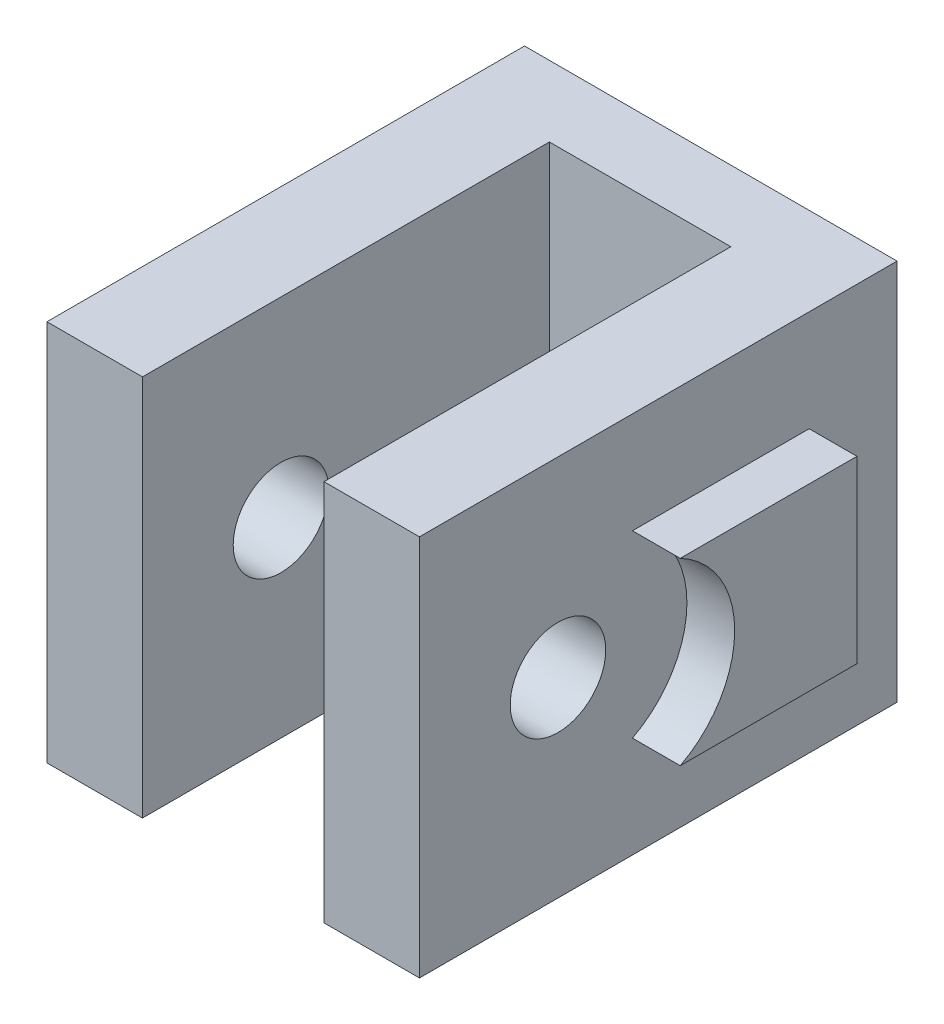
ISO-10303-21;
HEADER;
FILE_DESCRIPTION(('STEP AP214'),'2;1');
FILE_NAME('part.step','',(''),(''),'','','');
FILE_SCHEMA(('AUTOMOTIVE_DESIGN { 1 0 10303 214 1 1 1 1 }'));
ENDSEC;
DATA;
#1=APPLICATION_CONTEXT('core data for automotive mechanical design processes');
#2=APPLICATION_PROTOCOL_DEFINITION('international standard','automotive_design',2000,#1);
#3=PRODUCT_CONTEXT('',#1,'mechanical');
#4=PRODUCT('Part','Part','',(#3));
#5=PRODUCT_RELATED_PRODUCT_CATEGORY('part','',(#4));
#6=PRODUCT_DEFINITION_FORMATION('','',#4);
#7=PRODUCT_DEFINITION_CONTEXT('part definition',#1,'design');
#8=PRODUCT_DEFINITION('design','',#6,#7);
#9=PRODUCT_DEFINITION_SHAPE('','',#8);
#10=(LENGTH_UNIT() NAMED_UNIT(*) SI_UNIT(.MILLI.,.METRE.));
#11=(NAMED_UNIT(*) PLANE_ANGLE_UNIT() SI_UNIT($,.RADIAN.));
#12=(NAMED_UNIT(*) SI_UNIT($,.STERADIAN.) SOLID_ANGLE_UNIT());
#13=UNCERTAINTY_MEASURE_WITH_UNIT(LENGTH_MEASURE(1.E-05),#10,'distance_accuracy_value','');
#14=(GEOMETRIC_REPRESENTATION_CONTEXT(3) GLOBAL_UNCERTAINTY_ASSIGNED_CONTEXT((#13)) GLOBAL_UNIT_ASSIGNED_CONTEXT((#10,
#11,#12)) REPRESENTATION_CONTEXT('',''));
#15=CARTESIAN_POINT('',(0.,0.,0.));
#16=DIRECTION('',(0.,0.,1.));
#17=DIRECTION('',(1.,0.,0.));
#18=AXIS2_PLACEMENT_3D('',#15,#16,#17);
#19=CARTESIAN_POINT('',(0.,20.,0.));
#20=DIRECTION('',(1.,0.,0.));
#21=DIRECTION('',(0.,0.,-1.));
#22=AXIS2_PLACEMENT_3D('',#19,#20,#21);
#23=PLANE('',#22);
#24=DIRECTION('',(0.,0.,1.));
#25=VECTOR('',#24,1.);
#26=CARTESIAN_POINT('',(0.,0.,0.));
#27=LINE('',#26,#25);
#28=CARTESIAN_POINT('',(0.,0.,0.));
#29=VERTEX_POINT('',#28);
#30=CARTESIAN_POINT('',(0.,0.,25.));
#31=VERTEX_POINT('',#30);
#32=EDGE_CURVE('E258',#29,#31,#27,.T.);
#33=ORIENTED_EDGE('',*,*,#32,.T.);
#34=DIRECTION('',(0.,-1.,0.));
#35=VECTOR('',#34,1.);
#36=CARTESIAN_POINT('',(0.,20.,25.));
#37=LINE('',#36,#35);
#38=CARTESIAN_POINT('',(0.,20.,25.));
#39=VERTEX_POINT('',#38);
#40=EDGE_CURVE('E11',#39,#31,#37,.T.);
#41=ORIENTED_EDGE('',*,*,#40,.F.);
#42=DIRECTION('',(0.,0.,1.));
#43=VECTOR('',#42,1.);
#44=CARTESIAN_POINT('',(0.,20.,0.));
#45=LINE('',#44,#43);
#46=CARTESIAN_POINT('',(0.,20.,0.));
#47=VERTEX_POINT('',#46);
#48=EDGE_CURVE('E239',#47,#39,#45,.T.);
#49=ORIENTED_EDGE('',*,*,#48,.F.);
#50=DIRECTION('',(0.,-1.,0.));
#51=VECTOR('',#50,1.);
#52=CARTESIAN_POINT('',(0.,20.,0.));
#53=LINE('',#52,#51);
#54=EDGE_CURVE('E257',#47,#29,#53,.T.);
#55=ORIENTED_EDGE('',*,*,#54,.T.);
#56=EDGE_LOOP('',(#33,#41,#49,#55));
#57=FACE_BOUND('',#56,.T.);
#58=CARTESIAN_POINT('',(0.,10.,17.75));
#59=DIRECTION('',(1.,0.,0.));
#60=DIRECTION('',(0.,0.,-1.));
#61=AXIS2_PLACEMENT_3D('',#58,#59,#60);
#62=CIRCLE('',#61,2.5);
#63=CARTESIAN_POINT('',(0.,10.,15.25));
#64=VERTEX_POINT('',#63);
#65=EDGE_CURVE('E225',#64,#64,#62,.T.);
#66=ORIENTED_EDGE('',*,*,#65,.T.);
#67=EDGE_LOOP('',(#66));
#68=FACE_BOUND('',#67,.T.);
#69=CARTESIAN_POINT('',(0.,10.,16.2994897427832));
#70=DIRECTION('',(1.,0.,0.));
#71=DIRECTION('',(0.,0.,-1.));
#72=AXIS2_PLACEMENT_3D('',#69,#70,#71);
#73=CIRCLE('',#72,5.3);
#74=CARTESIAN_POINT('',(0.,5.3,13.85));
#75=VERTEX_POINT('',#74);
#76=CARTESIAN_POINT('',(0.,14.7,13.85));
#77=VERTEX_POINT('',#76);
#78=EDGE_CURVE('E186',#75,#77,#73,.T.);
#79=ORIENTED_EDGE('',*,*,#78,.F.);
#80=DIRECTION('',(0.,0.,-1.));
#81=VECTOR('',#80,1.);
#82=CARTESIAN_POINT('',(0.,5.3,13.85));
#83=LINE('',#82,#81);
#84=CARTESIAN_POINT('',(0.,5.3,4.60000000000001));
#85=VERTEX_POINT('',#84);
#86=EDGE_CURVE('E164',#75,#85,#83,.T.);
#87=ORIENTED_EDGE('',*,*,#86,.T.);
#88=DIRECTION('',(0.,-1.,0.));
#89=VECTOR('',#88,1.);
#90=CARTESIAN_POINT('',(0.,14.7,4.60000000000001));
#91=LINE('',#90,#89);
#92=CARTESIAN_POINT('',(0.,14.7,4.60000000000001));
#93=VERTEX_POINT('',#92);
#94=EDGE_CURVE('E58',#93,#85,#91,.T.);
#95=ORIENTED_EDGE('',*,*,#94,.F.);
#96=DIRECTION('',(0.,0.,-1.));
#97=VECTOR('',#96,1.);
#98=CARTESIAN_POINT('',(0.,14.7,13.85));
#99=LINE('',#98,#97);
#100=EDGE_CURVE('E177',#77,#93,#99,.T.);
#101=ORIENTED_EDGE('',*,*,#100,.F.);
#102=EDGE_LOOP('',(#79,#87,#95,#101));
#103=FACE_BOUND('',#102,.T.);
#104=ADVANCED_FACE('F43',(#57,#68,#103),#23,.F.);
#105=CARTESIAN_POINT('',(0.,20.,25.));
#106=DIRECTION('',(0.,0.,-1.));
#107=DIRECTION('',(-1.,0.,0.));
#108=AXIS2_PLACEMENT_3D('',#105,#106,#107);
#109=PLANE('',#108);
#110=DIRECTION('',(1.,0.,0.));
#111=VECTOR('',#110,1.);
#112=CARTESIAN_POINT('',(0.,0.,25.));
#113=LINE('',#112,#111);
#114=CARTESIAN_POINT('',(5.,0.,25.));
#115=VERTEX_POINT('',#114);
#116=EDGE_CURVE('E261',#31,#115,#113,.T.);
#117=ORIENTED_EDGE('',*,*,#116,.T.);
#118=DIRECTION('',(0.,-1.,0.));
#119=VECTOR('',#118,1.);
#120=CARTESIAN_POINT('',(5.,20.,25.));
#121=LINE('',#120,#119);
#122=CARTESIAN_POINT('',(5.,20.,25.));
#123=VERTEX_POINT('',#122);
#124=EDGE_CURVE('E51',#123,#115,#121,.T.);
#125=ORIENTED_EDGE('',*,*,#124,.F.);
#126=DIRECTION('',(1.,0.,0.));
#127=VECTOR('',#126,1.);
#128=CARTESIAN_POINT('',(0.,20.,25.));
#129=LINE('',#128,#127);
#130=EDGE_CURVE('E242',#39,#123,#129,.T.);
#131=ORIENTED_EDGE('',*,*,#130,.F.);
#132=ORIENTED_EDGE('',*,*,#40,.T.);
#133=EDGE_LOOP('',(#117,#125,#131,#132));
#134=FACE_BOUND('',#133,.T.);
#135=ADVANCED_FACE('F319',(#134),#109,.F.);
#136=CARTESIAN_POINT('',(5.,20.,25.));
#137=DIRECTION('',(-1.,0.,0.));
#138=DIRECTION('',(0.,0.,1.));
#139=AXIS2_PLACEMENT_3D('',#136,#137,#138);
#140=PLANE('',#139);
#141=CARTESIAN_POINT('',(5.,10.,17.75));
#142=DIRECTION('',(-1.,0.,0.));
#143=DIRECTION('',(0.,0.,1.));
#144=AXIS2_PLACEMENT_3D('',#141,#142,#143);
#145=CIRCLE('',#144,2.5);
#146=CARTESIAN_POINT('',(5.,10.,20.25));
#147=VERTEX_POINT('',#146);
#148=EDGE_CURVE('E233',#147,#147,#145,.T.);
#149=ORIENTED_EDGE('',*,*,#148,.T.);
#150=EDGE_LOOP('',(#149));
#151=FACE_BOUND('',#150,.T.);
#152=DIRECTION('',(0.,0.,-1.));
#153=VECTOR('',#152,1.);
#154=CARTESIAN_POINT('',(5.,0.,25.));
#155=LINE('',#154,#153);
#156=CARTESIAN_POINT('',(5.,0.,3.7));
#157=VERTEX_POINT('',#156);
#158=EDGE_CURVE('E263',#115,#157,#155,.T.);
#159=ORIENTED_EDGE('',*,*,#158,.T.);
#160=DIRECTION('',(0.,-1.,0.));
#161=VECTOR('',#160,1.);
#162=CARTESIAN_POINT('',(5.,20.,3.7));
#163=LINE('',#162,#161);
#164=CARTESIAN_POINT('',(5.,20.,3.7));
#165=VERTEX_POINT('',#164);
#166=EDGE_CURVE('E288',#165,#157,#163,.T.);
#167=ORIENTED_EDGE('',*,*,#166,.F.);
#168=DIRECTION('',(0.,0.,-1.));
#169=VECTOR('',#168,1.);
#170=CARTESIAN_POINT('',(5.,20.,25.));
#171=LINE('',#170,#169);
#172=EDGE_CURVE('E245',#123,#165,#171,.T.);
#173=ORIENTED_EDGE('',*,*,#172,.F.);
#174=ORIENTED_EDGE('',*,*,#124,.T.);
#175=EDGE_LOOP('',(#159,#167,#173,#174));
#176=FACE_BOUND('',#175,.T.);
#177=ADVANCED_FACE('F296',(#151,#176),#140,.F.);
#178=CARTESIAN_POINT('',(5.,20.,3.7));
#179=DIRECTION('',(0.,0.,-1.));
#180=DIRECTION('',(-1.,0.,0.));
#181=AXIS2_PLACEMENT_3D('',#178,#179,#180);
#182=PLANE('',#181);
#183=CARTESIAN_POINT('',(9.75,10.,3.7));
#184=DIRECTION('',(0.,0.,-1.));
#185=DIRECTION('',(-1.,0.,0.));
#186=AXIS2_PLACEMENT_3D('',#183,#184,#185);
#187=CIRCLE('',#186,2.1);
#188=CARTESIAN_POINT('',(7.65,10.,3.7));
#189=VERTEX_POINT('',#188);
#190=EDGE_CURVE('E46',#189,#189,#187,.T.);
#191=ORIENTED_EDGE('',*,*,#190,.T.);
#192=EDGE_LOOP('',(#191));
#193=FACE_BOUND('',#192,.T.);
#194=DIRECTION('',(1.,0.,0.));
#195=VECTOR('',#194,1.);
#196=CARTESIAN_POINT('',(5.,0.,3.7));
#197=LINE('',#196,#195);
#198=CARTESIAN_POINT('',(14.5,0.,3.7));
#199=VERTEX_POINT('',#198);
#200=EDGE_CURVE('E265',#157,#199,#197,.T.);
#201=ORIENTED_EDGE('',*,*,#200,.T.);
#202=DIRECTION('',(0.,-1.,0.));
#203=VECTOR('',#202,1.);
#204=CARTESIAN_POINT('',(14.5,20.,3.7));
#205=LINE('',#204,#203);
#206=CARTESIAN_POINT('',(14.5,20.,3.7));
#207=VERTEX_POINT('',#206);
#208=EDGE_CURVE('E285',#207,#199,#205,.T.);
#209=ORIENTED_EDGE('',*,*,#208,.F.);
#210=DIRECTION('',(1.,0.,0.));
#211=VECTOR('',#210,1.);
#212=CARTESIAN_POINT('',(5.,20.,3.7));
#213=LINE('',#212,#211);
#214=EDGE_CURVE('E247',#165,#207,#213,.T.);
#215=ORIENTED_EDGE('',*,*,#214,.F.);
#216=ORIENTED_EDGE('',*,*,#166,.T.);
#217=EDGE_LOOP('',(#201,#209,#215,#216));
#218=FACE_BOUND('',#217,.T.);
#219=ADVANCED_FACE('F307',(#193,#218),#182,.F.);
#220=CARTESIAN_POINT('',(14.5,20.,25.));
#221=DIRECTION('',(1.,0.,0.));
#222=DIRECTION('',(0.,0.,-1.));
#223=AXIS2_PLACEMENT_3D('',#220,#221,#222);
#224=PLANE('',#223);
#225=CARTESIAN_POINT('',(14.5,10.,17.75));
#226=DIRECTION('',(1.,0.,0.));
#227=DIRECTION('',(0.,0.,-1.));
#228=AXIS2_PLACEMENT_3D('',#225,#226,#227);
#229=CIRCLE('',#228,2.5);
#230=CARTESIAN_POINT('',(14.5,10.,15.25));
#231=VERTEX_POINT('',#230);
#232=EDGE_CURVE('E228',#231,#231,#229,.T.);
#233=ORIENTED_EDGE('',*,*,#232,.T.);
#234=EDGE_LOOP('',(#233));
#235=FACE_BOUND('',#234,.T.);
#236=DIRECTION('',(0.,0.,1.));
#237=VECTOR('',#236,1.);
#238=CARTESIAN_POINT('',(14.5,0.,25.));
#239=LINE('',#238,#237);
#240=CARTESIAN_POINT('',(14.5,0.,25.));
#241=VERTEX_POINT('',#240);
#242=EDGE_CURVE('E267',#199,#241,#239,.T.);
#243=ORIENTED_EDGE('',*,*,#242,.T.);
#244=DIRECTION('',(0.,-1.,0.));
#245=VECTOR('',#244,1.);
#246=CARTESIAN_POINT('',(14.5,20.,25.));
#247=LINE('',#246,#245);
#248=CARTESIAN_POINT('',(14.5,20.,25.));
#249=VERTEX_POINT('',#248);
#250=EDGE_CURVE('E282',#249,#241,#247,.T.);
#251=ORIENTED_EDGE('',*,*,#250,.F.);
#252=DIRECTION('',(0.,0.,1.));
#253=VECTOR('',#252,1.);
#254=CARTESIAN_POINT('',(14.5,20.,25.));
#255=LINE('',#254,#253);
#256=EDGE_CURVE('E249',#207,#249,#255,.T.);
#257=ORIENTED_EDGE('',*,*,#256,.F.);
#258=ORIENTED_EDGE('',*,*,#208,.T.);
#259=EDGE_LOOP('',(#243,#251,#257,#258));
#260=FACE_BOUND('',#259,.T.);
#261=ADVANCED_FACE('F311',(#235,#260),#224,.F.);
#262=CARTESIAN_POINT('',(14.5,20.,25.));
#263=DIRECTION('',(0.,0.,-1.));
#264=DIRECTION('',(-1.,0.,0.));
#265=AXIS2_PLACEMENT_3D('',#262,#263,#264);
#266=PLANE('',#265);
#267=DIRECTION('',(1.,0.,0.));
#268=VECTOR('',#267,1.);
#269=CARTESIAN_POINT('',(14.5,0.,25.));
#270=LINE('',#269,#268);
#271=CARTESIAN_POINT('',(19.5,0.,25.));
#272=VERTEX_POINT('',#271);
#273=EDGE_CURVE('E269',#241,#272,#270,.T.);
#274=ORIENTED_EDGE('',*,*,#273,.T.);
#275=DIRECTION('',(0.,-1.,0.));
#276=VECTOR('',#275,1.);
#277=CARTESIAN_POINT('',(19.5,20.,25.));
#278=LINE('',#277,#276);
#279=CARTESIAN_POINT('',(19.5,20.,25.));
#280=VERTEX_POINT('',#279);
#281=EDGE_CURVE('E279',#280,#272,#278,.T.);
#282=ORIENTED_EDGE('',*,*,#281,.F.);
#283=DIRECTION('',(1.,0.,0.));
#284=VECTOR('',#283,1.);
#285=CARTESIAN_POINT('',(14.5,20.,25.));
#286=LINE('',#285,#284);
#287=EDGE_CURVE('E251',#249,#280,#286,.T.);
#288=ORIENTED_EDGE('',*,*,#287,.F.);
#289=ORIENTED_EDGE('',*,*,#250,.T.);
#290=EDGE_LOOP('',(#274,#282,#288,#289));
#291=FACE_BOUND('',#290,.T.);
#292=ADVANCED_FACE('F333',(#291),#266,.F.);
#293=CARTESIAN_POINT('',(19.5,20.,0.));
#294=DIRECTION('',(-1.,0.,0.));
#295=DIRECTION('',(0.,0.,1.));
#296=AXIS2_PLACEMENT_3D('',#293,#294,#295);
#297=PLANE('',#296);
#298=DIRECTION('',(0.,0.,-1.));
#299=VECTOR('',#298,1.);
#300=CARTESIAN_POINT('',(19.5,5.3,13.85));
#301=LINE('',#300,#299);
#302=CARTESIAN_POINT('',(19.5,5.3,13.85));
#303=VERTEX_POINT('',#302);
#304=CARTESIAN_POINT('',(19.5,5.3,4.6));
#305=VERTEX_POINT('',#304);
#306=EDGE_CURVE('E200',#303,#305,#301,.T.);
#307=ORIENTED_EDGE('',*,*,#306,.F.);
#308=CARTESIAN_POINT('',(19.5,10.,16.2994897427832));
#309=DIRECTION('',(1.,0.,0.));
#310=DIRECTION('',(0.,0.,-1.));
#311=AXIS2_PLACEMENT_3D('',#308,#309,#310);
#312=CIRCLE('',#311,5.3);
#313=CARTESIAN_POINT('',(19.5,14.7,13.85));
#314=VERTEX_POINT('',#313);
#315=EDGE_CURVE('E192',#303,#314,#312,.T.);
#316=ORIENTED_EDGE('',*,*,#315,.T.);
#317=DIRECTION('',(0.,0.,-1.));
#318=VECTOR('',#317,1.);
#319=CARTESIAN_POINT('',(19.5,14.7,13.85));
#320=LINE('',#319,#318);
#321=CARTESIAN_POINT('',(19.5,14.7,4.6));
#322=VERTEX_POINT('',#321);
#323=EDGE_CURVE('E211',#314,#322,#320,.T.);
#324=ORIENTED_EDGE('',*,*,#323,.T.);
#325=DIRECTION('',(0.,-1.,0.));
#326=VECTOR('',#325,1.);
#327=CARTESIAN_POINT('',(19.5,14.7,4.6));
#328=LINE('',#327,#326);
#329=EDGE_CURVE('E66',#322,#305,#328,.T.);
#330=ORIENTED_EDGE('',*,*,#329,.T.);
#331=EDGE_LOOP('',(#307,#316,#324,#330));
#332=FACE_BOUND('',#331,.T.);
#333=CARTESIAN_POINT('',(19.5,10.,17.75));
#334=DIRECTION('',(1.,0.,0.));
#335=DIRECTION('',(0.,0.,-1.));
#336=AXIS2_PLACEMENT_3D('',#333,#334,#335);
#337=CIRCLE('',#336,2.5);
#338=CARTESIAN_POINT('',(19.5,10.,15.25));
#339=VERTEX_POINT('',#338);
#340=EDGE_CURVE('E219',#339,#339,#337,.T.);
#341=ORIENTED_EDGE('',*,*,#340,.F.);
#342=EDGE_LOOP('',(#341));
#343=FACE_BOUND('',#342,.T.);
#344=DIRECTION('',(0.,0.,-1.));
#345=VECTOR('',#344,1.);
#346=CARTESIAN_POINT('',(19.5,0.,0.));
#347=LINE('',#346,#345);
#348=CARTESIAN_POINT('',(19.5,0.,0.));
#349=VERTEX_POINT('',#348);
#350=EDGE_CURVE('E271',#272,#349,#347,.T.);
#351=ORIENTED_EDGE('',*,*,#350,.T.);
#352=DIRECTION('',(0.,-1.,0.));
#353=VECTOR('',#352,1.);
#354=CARTESIAN_POINT('',(19.5,20.,0.));
#355=LINE('',#354,#353);
#356=CARTESIAN_POINT('',(19.5,20.,0.));
#357=VERTEX_POINT('',#356);
#358=EDGE_CURVE('E276',#357,#349,#355,.T.);
#359=ORIENTED_EDGE('',*,*,#358,.F.);
#360=DIRECTION('',(0.,0.,-1.));
#361=VECTOR('',#360,1.);
#362=CARTESIAN_POINT('',(19.5,20.,0.));
#363=LINE('',#362,#361);
#364=EDGE_CURVE('E253',#280,#357,#363,.T.);
#365=ORIENTED_EDGE('',*,*,#364,.F.);
#366=ORIENTED_EDGE('',*,*,#281,.T.);
#367=EDGE_LOOP('',(#351,#359,#365,#366));
#368=FACE_BOUND('',#367,.T.);
#369=ADVANCED_FACE('F331',(#332,#343,#368),#297,.F.);
#370=CARTESIAN_POINT('',(0.,20.,0.));
#371=DIRECTION('',(0.,0.,1.));
#372=DIRECTION('',(1.,0.,0.));
#373=AXIS2_PLACEMENT_3D('',#370,#371,#372);
#374=PLANE('',#373);
#375=CARTESIAN_POINT('',(9.75,10.,0.));
#376=DIRECTION('',(0.,0.,-1.));
#377=DIRECTION('',(-1.,0.,0.));
#378=AXIS2_PLACEMENT_3D('',#375,#376,#377);
#379=CIRCLE('',#378,2.1);
#380=CARTESIAN_POINT('',(7.65,10.,0.));
#381=VERTEX_POINT('',#380);
#382=EDGE_CURVE('E236',#381,#381,#379,.T.);
#383=ORIENTED_EDGE('',*,*,#382,.F.);
#384=EDGE_LOOP('',(#383));
#385=FACE_BOUND('',#384,.T.);
#386=DIRECTION('',(-1.,0.,0.));
#387=VECTOR('',#386,1.);
#388=CARTESIAN_POINT('',(0.,0.,0.));
#389=LINE('',#388,#387);
#390=EDGE_CURVE('E243',#349,#29,#389,.T.);
#391=ORIENTED_EDGE('',*,*,#390,.T.);
#392=ORIENTED_EDGE('',*,*,#54,.F.);
#393=DIRECTION('',(-1.,0.,0.));
#394=VECTOR('',#393,1.);
#395=CARTESIAN_POINT('',(0.,20.,0.));
#396=LINE('',#395,#394);
#397=EDGE_CURVE('E255',#357,#47,#396,.T.);
#398=ORIENTED_EDGE('',*,*,#397,.F.);
#399=ORIENTED_EDGE('',*,*,#358,.T.);
#400=EDGE_LOOP('',(#391,#392,#398,#399));
#401=FACE_BOUND('',#400,.T.);
#402=ADVANCED_FACE('F326',(#385,#401),#374,.F.);
#403=CARTESIAN_POINT('',(0.,20.,0.));
#404=DIRECTION('',(0.,1.,0.));
#405=DIRECTION('',(0.,0.,1.));
#406=AXIS2_PLACEMENT_3D('',#403,#404,#405);
#407=PLANE('',#406);
#408=ORIENTED_EDGE('',*,*,#48,.T.);
#409=ORIENTED_EDGE('',*,*,#130,.T.);
#410=ORIENTED_EDGE('',*,*,#172,.T.);
#411=ORIENTED_EDGE('',*,*,#214,.T.);
#412=ORIENTED_EDGE('',*,*,#256,.T.);
#413=ORIENTED_EDGE('',*,*,#287,.T.);
#414=ORIENTED_EDGE('',*,*,#364,.T.);
#415=ORIENTED_EDGE('',*,*,#397,.T.);
#416=EDGE_LOOP('',(#408,#409,#410,#411,#412,#413,#414,#415));
#417=FACE_BOUND('',#416,.T.);
#418=ADVANCED_FACE('F315',(#417),#407,.T.);
#419=CARTESIAN_POINT('',(0.,0.,0.));
#420=DIRECTION('',(0.,1.,0.));
#421=DIRECTION('',(0.,0.,1.));
#422=AXIS2_PLACEMENT_3D('',#419,#420,#421);
#423=PLANE('',#422);
#424=ORIENTED_EDGE('',*,*,#32,.F.);
#425=ORIENTED_EDGE('',*,*,#390,.F.);
#426=ORIENTED_EDGE('',*,*,#350,.F.);
#427=ORIENTED_EDGE('',*,*,#273,.F.);
#428=ORIENTED_EDGE('',*,*,#242,.F.);
#429=ORIENTED_EDGE('',*,*,#200,.F.);
#430=ORIENTED_EDGE('',*,*,#158,.F.);
#431=ORIENTED_EDGE('',*,*,#116,.F.);
#432=EDGE_LOOP('',(#424,#425,#426,#427,#428,#429,#430,#431));
#433=FACE_BOUND('',#432,.T.);
#434=ADVANCED_FACE('F302',(#433),#423,.F.);
#435=CARTESIAN_POINT('',(9.75,10.,0.));
#436=DIRECTION('',(0.,0.,-1.));
#437=DIRECTION('',(-1.,0.,0.));
#438=AXIS2_PLACEMENT_3D('',#435,#436,#437);
#439=CYLINDRICAL_SURFACE('',#438,2.1);
#440=ORIENTED_EDGE('',*,*,#382,.T.);
#441=EDGE_LOOP('',(#440));
#442=FACE_BOUND('',#441,.T.);
#443=ORIENTED_EDGE('',*,*,#190,.F.);
#444=EDGE_LOOP('',(#443));
#445=FACE_BOUND('',#444,.T.);
#446=ADVANCED_FACE('F366',(#442,#445),#439,.F.);
#447=CARTESIAN_POINT('',(0.,10.,17.75));
#448=DIRECTION('',(1.,0.,0.));
#449=DIRECTION('',(0.,0.,-1.));
#450=AXIS2_PLACEMENT_3D('',#447,#448,#449);
#451=CYLINDRICAL_SURFACE('',#450,2.5);
#452=ORIENTED_EDGE('',*,*,#340,.T.);
#453=EDGE_LOOP('',(#452));
#454=FACE_BOUND('',#453,.T.);
#455=ORIENTED_EDGE('',*,*,#232,.F.);
#456=EDGE_LOOP('',(#455));
#457=FACE_BOUND('',#456,.T.);
#458=ADVANCED_FACE('F368',(#454,#457),#451,.F.);
#459=ORIENTED_EDGE('',*,*,#65,.F.);
#460=EDGE_LOOP('',(#459));
#461=FACE_BOUND('',#460,.T.);
#462=ORIENTED_EDGE('',*,*,#148,.F.);
#463=EDGE_LOOP('',(#462));
#464=FACE_BOUND('',#463,.T.);
#465=ADVANCED_FACE('F374',(#461,#464),#451,.F.);
#466=CARTESIAN_POINT('',(22.,10.,16.2994897427832));
#467=DIRECTION('',(-1.,0.,0.));
#468=DIRECTION('',(0.,0.,1.));
#469=AXIS2_PLACEMENT_3D('',#466,#467,#468);
#470=CYLINDRICAL_SURFACE('',#469,5.3);
#471=ORIENTED_EDGE('',*,*,#315,.F.);
#472=DIRECTION('',(-1.,0.,0.));
#473=VECTOR('',#472,1.);
#474=CARTESIAN_POINT('',(22.,5.3,13.85));
#475=LINE('',#474,#473);
#476=CARTESIAN_POINT('',(22.,5.3,13.85));
#477=VERTEX_POINT('',#476);
#478=EDGE_CURVE('E217',#477,#303,#475,.T.);
#479=ORIENTED_EDGE('',*,*,#478,.F.);
#480=CARTESIAN_POINT('',(22.,10.,16.2994897427832));
#481=DIRECTION('',(1.,0.,0.));
#482=DIRECTION('',(0.,0.,-1.));
#483=AXIS2_PLACEMENT_3D('',#480,#481,#482);
#484=CIRCLE('',#483,5.3);
#485=CARTESIAN_POINT('',(22.,14.7,13.85));
#486=VERTEX_POINT('',#485);
#487=EDGE_CURVE('E196',#477,#486,#484,.T.);
#488=ORIENTED_EDGE('',*,*,#487,.T.);
#489=DIRECTION('',(-1.,0.,0.));
#490=VECTOR('',#489,1.);
#491=CARTESIAN_POINT('',(22.,14.7,13.85));
#492=LINE('',#491,#490);
#493=EDGE_CURVE('E208',#486,#314,#492,.T.);
#494=ORIENTED_EDGE('',*,*,#493,.T.);
#495=EDGE_LOOP('',(#471,#479,#488,#494));
#496=FACE_BOUND('',#495,.T.);
#497=ADVANCED_FACE('F409',(#496),#470,.F.);
#498=CARTESIAN_POINT('',(22.,5.3,13.85));
#499=DIRECTION('',(0.,1.,0.));
#500=DIRECTION('',(0.,0.,1.));
#501=AXIS2_PLACEMENT_3D('',#498,#499,#500);
#502=PLANE('',#501);
#503=ORIENTED_EDGE('',*,*,#306,.T.);
#504=DIRECTION('',(-1.,0.,0.));
#505=VECTOR('',#504,1.);
#506=CARTESIAN_POINT('',(22.,5.3,4.6));
#507=LINE('',#506,#505);
#508=CARTESIAN_POINT('',(22.,5.3,4.6));
#509=VERTEX_POINT('',#508);
#510=EDGE_CURVE('E220',#509,#305,#507,.T.);
#511=ORIENTED_EDGE('',*,*,#510,.F.);
#512=DIRECTION('',(0.,0.,-1.));
#513=VECTOR('',#512,1.);
#514=CARTESIAN_POINT('',(22.,5.3,13.85));
#515=LINE('',#514,#513);
#516=EDGE_CURVE('E206',#477,#509,#515,.T.);
#517=ORIENTED_EDGE('',*,*,#516,.F.);
#518=ORIENTED_EDGE('',*,*,#478,.T.);
#519=EDGE_LOOP('',(#503,#511,#517,#518));
#520=FACE_BOUND('',#519,.T.);
#521=ADVANCED_FACE('F416',(#520),#502,.F.);
#522=CARTESIAN_POINT('',(22.,14.7,4.6));
#523=DIRECTION('',(0.,0.,-1.));
#524=DIRECTION('',(-1.,0.,0.));
#525=AXIS2_PLACEMENT_3D('',#522,#523,#524);
#526=PLANE('',#525);
#527=ORIENTED_EDGE('',*,*,#329,.F.);
#528=DIRECTION('',(-1.,0.,0.));
#529=VECTOR('',#528,1.);
#530=CARTESIAN_POINT('',(22.,14.7,4.6));
#531=LINE('',#530,#529);
#532=CARTESIAN_POINT('',(22.,14.7,4.6));
#533=VERTEX_POINT('',#532);
#534=EDGE_CURVE('E222',#533,#322,#531,.T.);
#535=ORIENTED_EDGE('',*,*,#534,.F.);
#536=DIRECTION('',(0.,-1.,0.));
#537=VECTOR('',#536,1.);
#538=CARTESIAN_POINT('',(22.,14.7,4.6));
#539=LINE('',#538,#537);
#540=EDGE_CURVE('E203',#533,#509,#539,.T.);
#541=ORIENTED_EDGE('',*,*,#540,.T.);
#542=ORIENTED_EDGE('',*,*,#510,.T.);
#543=EDGE_LOOP('',(#527,#535,#541,#542));
#544=FACE_BOUND('',#543,.T.);
#545=ADVANCED_FACE('F423',(#544),#526,.T.);
#546=CARTESIAN_POINT('',(22.,14.7,13.85));
#547=DIRECTION('',(0.,1.,0.));
#548=DIRECTION('',(0.,0.,1.));
#549=AXIS2_PLACEMENT_3D('',#546,#547,#548);
#550=PLANE('',#549);
#551=ORIENTED_EDGE('',*,*,#323,.F.);
#552=ORIENTED_EDGE('',*,*,#493,.F.);
#553=DIRECTION('',(0.,0.,-1.));
#554=VECTOR('',#553,1.);
#555=CARTESIAN_POINT('',(22.,14.7,13.85));
#556=LINE('',#555,#554);
#557=EDGE_CURVE('E199',#486,#533,#556,.T.);
#558=ORIENTED_EDGE('',*,*,#557,.T.);
#559=ORIENTED_EDGE('',*,*,#534,.T.);
#560=EDGE_LOOP('',(#551,#552,#558,#559));
#561=FACE_BOUND('',#560,.T.);
#562=ADVANCED_FACE('F431',(#561),#550,.T.);
#563=CARTESIAN_POINT('',(22.,10.,16.2994897427832));
#564=DIRECTION('',(1.,0.,0.));
#565=DIRECTION('',(0.,0.,-1.));
#566=AXIS2_PLACEMENT_3D('',#563,#564,#565);
#567=PLANE('',#566);
#568=ORIENTED_EDGE('',*,*,#487,.F.);
#569=ORIENTED_EDGE('',*,*,#516,.T.);
#570=ORIENTED_EDGE('',*,*,#540,.F.);
#571=ORIENTED_EDGE('',*,*,#557,.F.);
#572=EDGE_LOOP('',(#568,#569,#570,#571));
#573=FACE_BOUND('',#572,.T.);
#574=ADVANCED_FACE('F438',(#573),#567,.T.);
#575=CARTESIAN_POINT('',(-2.5,10.,16.2994897427832));
#576=DIRECTION('',(1.,0.,0.));
#577=DIRECTION('',(0.,0.,-1.));
#578=AXIS2_PLACEMENT_3D('',#575,#576,#577);
#579=CYLINDRICAL_SURFACE('',#578,5.3);
#580=ORIENTED_EDGE('',*,*,#78,.T.);
#581=DIRECTION('',(1.,0.,0.));
#582=VECTOR('',#581,1.);
#583=CARTESIAN_POINT('',(-2.5,14.7,13.85));
#584=LINE('',#583,#582);
#585=CARTESIAN_POINT('',(-2.5,14.7,13.85));
#586=VERTEX_POINT('',#585);
#587=EDGE_CURVE('E175',#586,#77,#584,.T.);
#588=ORIENTED_EDGE('',*,*,#587,.F.);
#589=CARTESIAN_POINT('',(-2.5,10.,16.2994897427832));
#590=DIRECTION('',(1.,0.,0.));
#591=DIRECTION('',(0.,0.,-1.));
#592=AXIS2_PLACEMENT_3D('',#589,#590,#591);
#593=CIRCLE('',#592,5.3);
#594=CARTESIAN_POINT('',(-2.5,5.3,13.85));
#595=VERTEX_POINT('',#594);
#596=EDGE_CURVE('E173',#595,#586,#593,.T.);
#597=ORIENTED_EDGE('',*,*,#596,.F.);
#598=DIRECTION('',(1.,0.,0.));
#599=VECTOR('',#598,1.);
#600=CARTESIAN_POINT('',(-2.5,5.3,13.85));
#601=LINE('',#600,#599);
#602=EDGE_CURVE('E158',#595,#75,#601,.T.);
#603=ORIENTED_EDGE('',*,*,#602,.T.);
#604=EDGE_LOOP('',(#580,#588,#597,#603));
#605=FACE_BOUND('',#604,.T.);
#606=ADVANCED_FACE('F174',(#605),#579,.F.);
#607=CARTESIAN_POINT('',(-2.5,14.7,13.85));
#608=DIRECTION('',(0.,-1.,0.));
#609=DIRECTION('',(0.,0.,-1.));
#610=AXIS2_PLACEMENT_3D('',#607,#608,#609);
#611=PLANE('',#610);
#612=ORIENTED_EDGE('',*,*,#100,.T.);
#613=DIRECTION('',(1.,0.,0.));
#614=VECTOR('',#613,1.);
#615=CARTESIAN_POINT('',(-2.5,14.7,4.60000000000001));
#616=LINE('',#615,#614);
#617=CARTESIAN_POINT('',(-2.5,14.7,4.60000000000001));
#618=VERTEX_POINT('',#617);
#619=EDGE_CURVE('E193',#618,#93,#616,.T.);
#620=ORIENTED_EDGE('',*,*,#619,.F.);
#621=DIRECTION('',(0.,0.,-1.));
#622=VECTOR('',#621,1.);
#623=CARTESIAN_POINT('',(-2.5,14.7,13.85));
#624=LINE('',#623,#622);
#625=EDGE_CURVE('E169',#586,#618,#624,.T.);
#626=ORIENTED_EDGE('',*,*,#625,.F.);
#627=ORIENTED_EDGE('',*,*,#587,.T.);
#628=EDGE_LOOP('',(#612,#620,#626,#627));
#629=FACE_BOUND('',#628,.T.);
#630=ADVANCED_FACE('F453',(#629),#611,.F.);
#631=CARTESIAN_POINT('',(-2.5,14.7,4.60000000000001));
#632=DIRECTION('',(0.,0.,1.));
#633=DIRECTION('',(1.,0.,0.));
#634=AXIS2_PLACEMENT_3D('',#631,#632,#633);
#635=PLANE('',#634);
#636=ORIENTED_EDGE('',*,*,#94,.T.);
#637=DIRECTION('',(1.,0.,0.));
#638=VECTOR('',#637,1.);
#639=CARTESIAN_POINT('',(-2.5,5.3,4.60000000000001));
#640=LINE('',#639,#638);
#641=CARTESIAN_POINT('',(-2.5,5.3,4.60000000000001));
#642=VERTEX_POINT('',#641);
#643=EDGE_CURVE('E168',#642,#85,#640,.T.);
#644=ORIENTED_EDGE('',*,*,#643,.F.);
#645=DIRECTION('',(0.,-1.,0.));
#646=VECTOR('',#645,1.);
#647=CARTESIAN_POINT('',(-2.5,14.7,4.60000000000001));
#648=LINE('',#647,#646);
#649=EDGE_CURVE('E181',#618,#642,#648,.T.);
#650=ORIENTED_EDGE('',*,*,#649,.F.);
#651=ORIENTED_EDGE('',*,*,#619,.T.);
#652=EDGE_LOOP('',(#636,#644,#650,#651));
#653=FACE_BOUND('',#652,.T.);
#654=ADVANCED_FACE('F460',(#653),#635,.F.);
#655=CARTESIAN_POINT('',(-2.5,5.3,13.85));
#656=DIRECTION('',(0.,-1.,0.));
#657=DIRECTION('',(0.,0.,-1.));
#658=AXIS2_PLACEMENT_3D('',#655,#656,#657);
#659=PLANE('',#658);
#660=ORIENTED_EDGE('',*,*,#86,.F.);
#661=ORIENTED_EDGE('',*,*,#602,.F.);
#662=DIRECTION('',(0.,0.,-1.));
#663=VECTOR('',#662,1.);
#664=CARTESIAN_POINT('',(-2.5,5.3,13.85));
#665=LINE('',#664,#663);
#666=EDGE_CURVE('E162',#595,#642,#665,.T.);
#667=ORIENTED_EDGE('',*,*,#666,.T.);
#668=ORIENTED_EDGE('',*,*,#643,.T.);
#669=EDGE_LOOP('',(#660,#661,#667,#668));
#670=FACE_BOUND('',#669,.T.);
#671=ADVANCED_FACE('F160',(#670),#659,.T.);
#672=CARTESIAN_POINT('',(-2.5,10.,16.2994897427832));
#673=DIRECTION('',(-1.,0.,0.));
#674=DIRECTION('',(0.,0.,-1.));
#675=AXIS2_PLACEMENT_3D('',#672,#673,#674);
#676=PLANE('',#675);
#677=ORIENTED_EDGE('',*,*,#596,.T.);
#678=ORIENTED_EDGE('',*,*,#625,.T.);
#679=ORIENTED_EDGE('',*,*,#649,.T.);
#680=ORIENTED_EDGE('',*,*,#666,.F.);
#681=EDGE_LOOP('',(#677,#678,#679,#680));
#682=FACE_BOUND('',#681,.T.);
#683=ADVANCED_FACE('F179',(#682),#676,.T.);
#684=CLOSED_SHELL('',(#104,#135,#177,#219,#261,#292,#369,#402,#418,#434,#446,#458,#465,#497,
#521,#545,#562,#574,#606,#630,#654,#671,#683));
#685=MANIFOLD_SOLID_BREP('B2',#684);
#686=ADVANCED_BREP_SHAPE_REPRESENTATION('',(#18,#685),#14);
#687=SHAPE_DEFINITION_REPRESENTATION(#9,#686);
ENDSEC;
END-ISO-10303-21;
